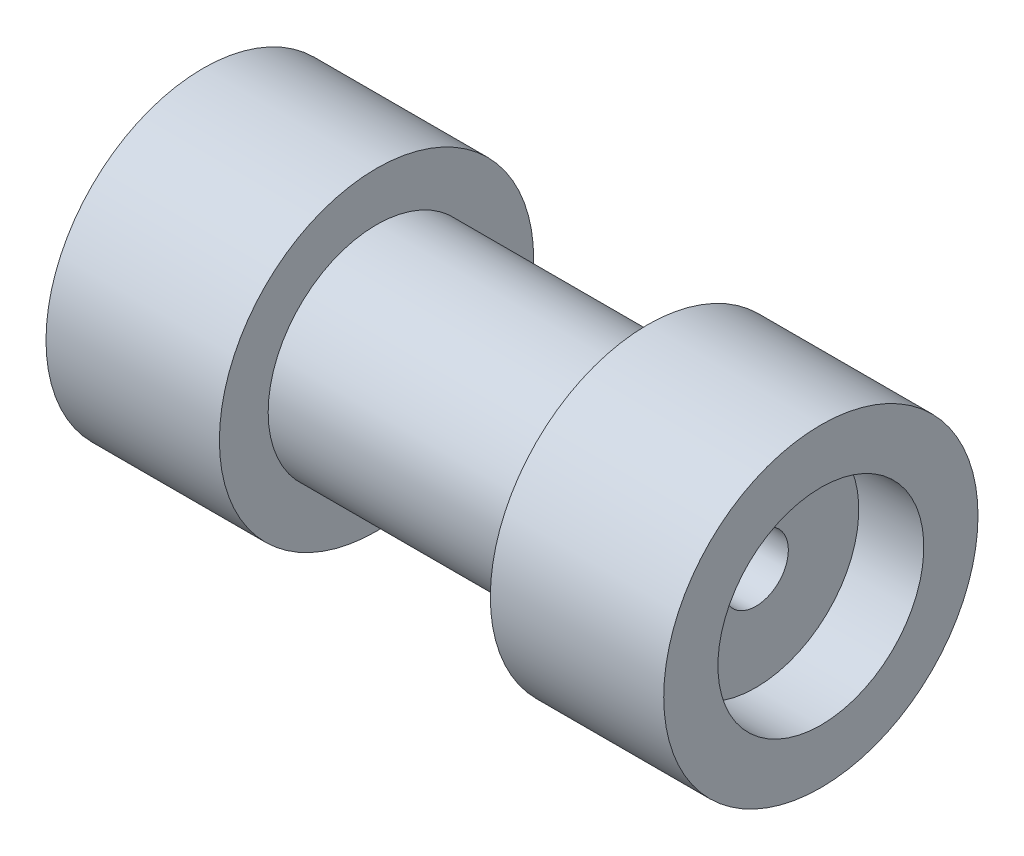
ISO-10303-21;
HEADER;
FILE_DESCRIPTION(('STEP AP214'),'2;1');
FILE_NAME('part.step','',(''),(''),'','','');
FILE_SCHEMA(('AUTOMOTIVE_DESIGN { 1 0 10303 214 1 1 1 1 }'));
ENDSEC;
DATA;
#1=APPLICATION_CONTEXT('core data for automotive mechanical design processes');
#2=APPLICATION_PROTOCOL_DEFINITION('international standard','automotive_design',2000,#1);
#3=PRODUCT_CONTEXT('',#1,'mechanical');
#4=PRODUCT('Part','Part','',(#3));
#5=PRODUCT_RELATED_PRODUCT_CATEGORY('part','',(#4));
#6=PRODUCT_DEFINITION_FORMATION('','',#4);
#7=PRODUCT_DEFINITION_CONTEXT('part definition',#1,'design');
#8=PRODUCT_DEFINITION('design','',#6,#7);
#9=PRODUCT_DEFINITION_SHAPE('','',#8);
#10=(LENGTH_UNIT() NAMED_UNIT(*) SI_UNIT(.MILLI.,.METRE.));
#11=(NAMED_UNIT(*) PLANE_ANGLE_UNIT() SI_UNIT($,.RADIAN.));
#12=(NAMED_UNIT(*) SI_UNIT($,.STERADIAN.) SOLID_ANGLE_UNIT());
#13=UNCERTAINTY_MEASURE_WITH_UNIT(LENGTH_MEASURE(1.E-05),#10,'distance_accuracy_value','');
#14=(GEOMETRIC_REPRESENTATION_CONTEXT(3) GLOBAL_UNCERTAINTY_ASSIGNED_CONTEXT((#13)) GLOBAL_UNIT_ASSIGNED_CONTEXT((#10,
#11,#12)) REPRESENTATION_CONTEXT('',''));
#15=CARTESIAN_POINT('',(0.,0.,0.));
#16=DIRECTION('',(0.,0.,1.));
#17=DIRECTION('',(1.,0.,0.));
#18=AXIS2_PLACEMENT_3D('',#15,#16,#17);
#19=CARTESIAN_POINT('',(-12.5,10.,0.));
#20=DIRECTION('',(-1.,0.,0.));
#21=DIRECTION('',(0.,-1.,0.));
#22=AXIS2_PLACEMENT_3D('',#19,#20,#21);
#23=PLANE('',#22);
#24=CARTESIAN_POINT('',(-12.5,0.,0.));
#25=DIRECTION('',(-1.,0.,0.));
#26=DIRECTION('',(0.,-1.,0.));
#27=AXIS2_PLACEMENT_3D('',#24,#25,#26);
#28=CIRCLE('',#27,14.5);
#29=CARTESIAN_POINT('',(-12.5,-14.5,0.));
#30=VERTEX_POINT('',#29);
#31=EDGE_CURVE('E10',#30,#30,#28,.T.);
#32=ORIENTED_EDGE('',*,*,#31,.F.);
#33=EDGE_LOOP('',(#32));
#34=FACE_BOUND('',#33,.T.);
#35=CARTESIAN_POINT('',(-12.5,0.,0.));
#36=DIRECTION('',(-1.,0.,0.));
#37=DIRECTION('',(0.,-1.,0.));
#38=AXIS2_PLACEMENT_3D('',#35,#36,#37);
#39=CIRCLE('',#38,10.);
#40=CARTESIAN_POINT('',(-12.5,-10.,0.));
#41=VERTEX_POINT('',#40);
#42=EDGE_CURVE('E71',#41,#41,#39,.T.);
#43=ORIENTED_EDGE('',*,*,#42,.T.);
#44=EDGE_LOOP('',(#43));
#45=FACE_BOUND('',#44,.T.);
#46=ADVANCED_FACE('F37',(#34,#45),#23,.F.);
#47=CARTESIAN_POINT('',(-22.5,0.,0.));
#48=DIRECTION('',(-1.,0.,0.));
#49=DIRECTION('',(0.,-1.,0.));
#50=AXIS2_PLACEMENT_3D('',#47,#48,#49);
#51=CYLINDRICAL_SURFACE('',#50,14.5);
#52=CARTESIAN_POINT('',(-28.5,0.,0.));
#53=DIRECTION('',(-1.,0.,0.));
#54=DIRECTION('',(0.,-1.,0.));
#55=AXIS2_PLACEMENT_3D('',#52,#53,#54);
#56=CIRCLE('',#55,14.5);
#57=CARTESIAN_POINT('',(-28.5,-14.5,0.));
#58=VERTEX_POINT('',#57);
#59=EDGE_CURVE('E44',#58,#58,#56,.T.);
#60=ORIENTED_EDGE('',*,*,#59,.F.);
#61=EDGE_LOOP('',(#60));
#62=FACE_BOUND('',#61,.T.);
#63=ORIENTED_EDGE('',*,*,#31,.T.);
#64=EDGE_LOOP('',(#63));
#65=FACE_BOUND('',#64,.T.);
#66=ADVANCED_FACE('F96',(#62,#65),#51,.T.);
#67=CARTESIAN_POINT('',(-28.5,14.5,0.));
#68=DIRECTION('',(1.,0.,0.));
#69=DIRECTION('',(0.,1.,0.));
#70=AXIS2_PLACEMENT_3D('',#67,#68,#69);
#71=PLANE('',#70);
#72=CARTESIAN_POINT('',(-28.5,0.,0.));
#73=DIRECTION('',(-1.,0.,0.));
#74=DIRECTION('',(0.,-1.,0.));
#75=AXIS2_PLACEMENT_3D('',#72,#73,#74);
#76=CIRCLE('',#75,9.5);
#77=CARTESIAN_POINT('',(-28.5,-9.5,0.));
#78=VERTEX_POINT('',#77);
#79=EDGE_CURVE('E48',#78,#78,#76,.T.);
#80=ORIENTED_EDGE('',*,*,#79,.F.);
#81=EDGE_LOOP('',(#80));
#82=FACE_BOUND('',#81,.T.);
#83=ORIENTED_EDGE('',*,*,#59,.T.);
#84=EDGE_LOOP('',(#83));
#85=FACE_BOUND('',#84,.T.);
#86=ADVANCED_FACE('F101',(#82,#85),#71,.F.);
#87=CARTESIAN_POINT('',(-22.5,0.,0.));
#88=DIRECTION('',(-1.,0.,0.));
#89=DIRECTION('',(0.,-1.,0.));
#90=AXIS2_PLACEMENT_3D('',#87,#88,#89);
#91=CYLINDRICAL_SURFACE('',#90,9.5);
#92=CARTESIAN_POINT('',(-22.5,0.,0.));
#93=DIRECTION('',(-1.,0.,0.));
#94=DIRECTION('',(0.,-1.,0.));
#95=AXIS2_PLACEMENT_3D('',#92,#93,#94);
#96=CIRCLE('',#95,9.5);
#97=CARTESIAN_POINT('',(-22.5,-9.5,0.));
#98=VERTEX_POINT('',#97);
#99=EDGE_CURVE('E53',#98,#98,#96,.T.);
#100=ORIENTED_EDGE('',*,*,#99,.F.);
#101=EDGE_LOOP('',(#100));
#102=FACE_BOUND('',#101,.T.);
#103=ORIENTED_EDGE('',*,*,#79,.T.);
#104=EDGE_LOOP('',(#103));
#105=FACE_BOUND('',#104,.T.);
#106=ADVANCED_FACE('F135',(#102,#105),#91,.F.);
#107=CARTESIAN_POINT('',(-22.5,9.5,0.));
#108=DIRECTION('',(1.,0.,0.));
#109=DIRECTION('',(0.,1.,0.));
#110=AXIS2_PLACEMENT_3D('',#107,#108,#109);
#111=PLANE('',#110);
#112=CARTESIAN_POINT('',(-22.5,0.,0.));
#113=DIRECTION('',(-1.,0.,0.));
#114=DIRECTION('',(0.,-1.,0.));
#115=AXIS2_PLACEMENT_3D('',#112,#113,#114);
#116=CIRCLE('',#115,3.);
#117=CARTESIAN_POINT('',(-22.5,-3.,0.));
#118=VERTEX_POINT('',#117);
#119=EDGE_CURVE('E74',#118,#118,#116,.T.);
#120=ORIENTED_EDGE('',*,*,#119,.F.);
#121=EDGE_LOOP('',(#120));
#122=FACE_BOUND('',#121,.T.);
#123=ORIENTED_EDGE('',*,*,#99,.T.);
#124=EDGE_LOOP('',(#123));
#125=FACE_BOUND('',#124,.T.);
#126=ADVANCED_FACE('F130',(#122,#125),#111,.F.);
#127=CARTESIAN_POINT('',(22.5,9.5,0.));
#128=DIRECTION('',(-1.,0.,0.));
#129=DIRECTION('',(0.,-1.,0.));
#130=AXIS2_PLACEMENT_3D('',#127,#128,#129);
#131=PLANE('',#130);
#132=CARTESIAN_POINT('',(22.5,0.,0.));
#133=DIRECTION('',(-1.,0.,0.));
#134=DIRECTION('',(0.,-1.,0.));
#135=AXIS2_PLACEMENT_3D('',#132,#133,#134);
#136=CIRCLE('',#135,3.);
#137=CARTESIAN_POINT('',(22.5,-3.00000000000002,0.));
#138=VERTEX_POINT('',#137);
#139=EDGE_CURVE('E40',#138,#138,#136,.T.);
#140=ORIENTED_EDGE('',*,*,#139,.T.);
#141=EDGE_LOOP('',(#140));
#142=FACE_BOUND('',#141,.T.);
#143=CARTESIAN_POINT('',(22.5,0.,0.));
#144=DIRECTION('',(-1.,0.,0.));
#145=DIRECTION('',(0.,-1.,0.));
#146=AXIS2_PLACEMENT_3D('',#143,#144,#145);
#147=CIRCLE('',#146,9.5);
#148=CARTESIAN_POINT('',(22.5,-9.49999999999999,0.));
#149=VERTEX_POINT('',#148);
#150=EDGE_CURVE('E56',#149,#149,#147,.T.);
#151=ORIENTED_EDGE('',*,*,#150,.F.);
#152=EDGE_LOOP('',(#151));
#153=FACE_BOUND('',#152,.T.);
#154=ADVANCED_FACE('F81',(#142,#153),#131,.F.);
#155=CARTESIAN_POINT('',(-22.5,0.,0.));
#156=DIRECTION('',(-1.,0.,0.));
#157=DIRECTION('',(0.,-1.,0.));
#158=AXIS2_PLACEMENT_3D('',#155,#156,#157);
#159=CYLINDRICAL_SURFACE('',#158,9.5);
#160=CARTESIAN_POINT('',(28.5,0.,0.));
#161=DIRECTION('',(-1.,0.,0.));
#162=DIRECTION('',(0.,-1.,0.));
#163=AXIS2_PLACEMENT_3D('',#160,#161,#162);
#164=CIRCLE('',#163,9.5);
#165=CARTESIAN_POINT('',(28.5,-9.49999999999999,0.));
#166=VERTEX_POINT('',#165);
#167=EDGE_CURVE('E59',#166,#166,#164,.T.);
#168=ORIENTED_EDGE('',*,*,#167,.F.);
#169=EDGE_LOOP('',(#168));
#170=FACE_BOUND('',#169,.T.);
#171=ORIENTED_EDGE('',*,*,#150,.T.);
#172=EDGE_LOOP('',(#171));
#173=FACE_BOUND('',#172,.T.);
#174=ADVANCED_FACE('F122',(#170,#173),#159,.F.);
#175=CARTESIAN_POINT('',(28.5,14.5,0.));
#176=DIRECTION('',(-1.,0.,0.));
#177=DIRECTION('',(0.,-1.,0.));
#178=AXIS2_PLACEMENT_3D('',#175,#176,#177);
#179=PLANE('',#178);
#180=CARTESIAN_POINT('',(28.5,0.,0.));
#181=DIRECTION('',(-1.,0.,0.));
#182=DIRECTION('',(0.,-1.,0.));
#183=AXIS2_PLACEMENT_3D('',#180,#181,#182);
#184=CIRCLE('',#183,14.5);
#185=CARTESIAN_POINT('',(28.5,-14.5,0.));
#186=VERTEX_POINT('',#185);
#187=EDGE_CURVE('E62',#186,#186,#184,.T.);
#188=ORIENTED_EDGE('',*,*,#187,.F.);
#189=EDGE_LOOP('',(#188));
#190=FACE_BOUND('',#189,.T.);
#191=ORIENTED_EDGE('',*,*,#167,.T.);
#192=EDGE_LOOP('',(#191));
#193=FACE_BOUND('',#192,.T.);
#194=ADVANCED_FACE('F116',(#190,#193),#179,.F.);
#195=CARTESIAN_POINT('',(-22.5,0.,0.));
#196=DIRECTION('',(-1.,0.,0.));
#197=DIRECTION('',(0.,-1.,0.));
#198=AXIS2_PLACEMENT_3D('',#195,#196,#197);
#199=CYLINDRICAL_SURFACE('',#198,14.5);
#200=CARTESIAN_POINT('',(12.5,0.,0.));
#201=DIRECTION('',(-1.,0.,0.));
#202=DIRECTION('',(0.,-1.,0.));
#203=AXIS2_PLACEMENT_3D('',#200,#201,#202);
#204=CIRCLE('',#203,14.5);
#205=CARTESIAN_POINT('',(12.5,-14.5,0.));
#206=VERTEX_POINT('',#205);
#207=EDGE_CURVE('E65',#206,#206,#204,.T.);
#208=ORIENTED_EDGE('',*,*,#207,.F.);
#209=EDGE_LOOP('',(#208));
#210=FACE_BOUND('',#209,.T.);
#211=ORIENTED_EDGE('',*,*,#187,.T.);
#212=EDGE_LOOP('',(#211));
#213=FACE_BOUND('',#212,.T.);
#214=ADVANCED_FACE('F110',(#210,#213),#199,.T.);
#215=CARTESIAN_POINT('',(12.5,10.,0.));
#216=DIRECTION('',(1.,0.,0.));
#217=DIRECTION('',(0.,1.,0.));
#218=AXIS2_PLACEMENT_3D('',#215,#216,#217);
#219=PLANE('',#218);
#220=CARTESIAN_POINT('',(12.5,0.,0.));
#221=DIRECTION('',(-1.,0.,0.));
#222=DIRECTION('',(0.,-1.,0.));
#223=AXIS2_PLACEMENT_3D('',#220,#221,#222);
#224=CIRCLE('',#223,10.);
#225=CARTESIAN_POINT('',(12.5,-10.,0.));
#226=VERTEX_POINT('',#225);
#227=EDGE_CURVE('E68',#226,#226,#224,.T.);
#228=ORIENTED_EDGE('',*,*,#227,.F.);
#229=EDGE_LOOP('',(#228));
#230=FACE_BOUND('',#229,.T.);
#231=ORIENTED_EDGE('',*,*,#207,.T.);
#232=EDGE_LOOP('',(#231));
#233=FACE_BOUND('',#232,.T.);
#234=ADVANCED_FACE('F92',(#230,#233),#219,.F.);
#235=CARTESIAN_POINT('',(-22.5,0.,0.));
#236=DIRECTION('',(-1.,0.,0.));
#237=DIRECTION('',(0.,-1.,0.));
#238=AXIS2_PLACEMENT_3D('',#235,#236,#237);
#239=CYLINDRICAL_SURFACE('',#238,10.);
#240=ORIENTED_EDGE('',*,*,#42,.F.);
#241=EDGE_LOOP('',(#240));
#242=FACE_BOUND('',#241,.T.);
#243=ORIENTED_EDGE('',*,*,#227,.T.);
#244=EDGE_LOOP('',(#243));
#245=FACE_BOUND('',#244,.T.);
#246=ADVANCED_FACE('F86',(#242,#245),#239,.T.);
#247=CARTESIAN_POINT('',(28.5,0.,0.));
#248=DIRECTION('',(-1.,0.,0.));
#249=DIRECTION('',(0.,-1.,0.));
#250=AXIS2_PLACEMENT_3D('',#247,#248,#249);
#251=CYLINDRICAL_SURFACE('',#250,3.);
#252=CARTESIAN_POINT('',(-22.5,-3.,0.));
#253=CARTESIAN_POINT('',(-22.03125,-3.,0.));
#254=CARTESIAN_POINT('',(-21.5625,-3.,0.));
#255=CARTESIAN_POINT('',(-20.625,-3.,0.));
#256=CARTESIAN_POINT('',(-20.15625,-3.,0.));
#257=CARTESIAN_POINT('',(-19.21875,-3.,0.));
#258=CARTESIAN_POINT('',(-18.75,-3.,0.));
#259=CARTESIAN_POINT('',(-17.8125,-3.,0.));
#260=CARTESIAN_POINT('',(-17.34375,-3.,0.));
#261=CARTESIAN_POINT('',(-16.40625,-3.,0.));
#262=CARTESIAN_POINT('',(-15.9375,-3.00000000000001,0.));
#263=CARTESIAN_POINT('',(-15.,-3.00000000000001,0.));
#264=CARTESIAN_POINT('',(-14.53125,-3.00000000000001,0.));
#265=CARTESIAN_POINT('',(-13.59375,-3.00000000000001,0.));
#266=CARTESIAN_POINT('',(-13.125,-3.00000000000001,0.));
#267=CARTESIAN_POINT('',(-12.1875,-3.00000000000001,0.));
#268=CARTESIAN_POINT('',(-11.71875,-3.00000000000001,0.));
#269=CARTESIAN_POINT('',(-10.78125,-3.00000000000001,0.));
#270=CARTESIAN_POINT('',(-10.3125,-3.00000000000001,0.));
#271=CARTESIAN_POINT('',(-9.37499999999999,-3.00000000000001,0.));
#272=CARTESIAN_POINT('',(-8.90624999999999,-3.00000000000001,0.));
#273=CARTESIAN_POINT('',(-7.96874999999999,-3.00000000000001,0.));
#274=CARTESIAN_POINT('',(-7.5,-3.00000000000001,0.));
#275=CARTESIAN_POINT('',(-6.5625,-3.00000000000001,0.));
#276=CARTESIAN_POINT('',(-6.09375,-3.00000000000001,0.));
#277=CARTESIAN_POINT('',(-5.15625,-3.00000000000001,0.));
#278=CARTESIAN_POINT('',(-4.68749999999999,-3.00000000000001,0.));
#279=CARTESIAN_POINT('',(-3.74999999999999,-3.00000000000001,0.));
#280=CARTESIAN_POINT('',(-3.28124999999999,-3.00000000000001,0.));
#281=CARTESIAN_POINT('',(-2.34375,-3.00000000000001,0.));
#282=CARTESIAN_POINT('',(-1.875,-3.00000000000001,0.));
#283=CARTESIAN_POINT('',(-0.937499999999997,-3.00000000000001,0.));
#284=CARTESIAN_POINT('',(-0.468749999999997,-3.00000000000001,0.));
#285=CARTESIAN_POINT('',(0.468750000000004,-3.00000000000001,0.));
#286=CARTESIAN_POINT('',(0.937500000000004,-3.00000000000001,0.));
#287=CARTESIAN_POINT('',(1.87500000000001,-3.00000000000001,0.));
#288=CARTESIAN_POINT('',(2.34375000000001,-3.00000000000001,0.));
#289=CARTESIAN_POINT('',(3.28125,-3.00000000000001,0.));
#290=CARTESIAN_POINT('',(3.75,-3.00000000000001,0.));
#291=CARTESIAN_POINT('',(4.6875,-3.00000000000001,0.));
#292=CARTESIAN_POINT('',(5.15625,-3.00000000000001,0.));
#293=CARTESIAN_POINT('',(6.09375000000001,-3.00000000000001,0.));
#294=CARTESIAN_POINT('',(6.56250000000001,-3.00000000000001,0.));
#295=CARTESIAN_POINT('',(7.50000000000001,-3.00000000000001,0.));
#296=CARTESIAN_POINT('',(7.96875000000001,-3.00000000000001,0.));
#297=CARTESIAN_POINT('',(8.90625000000001,-3.00000000000001,0.));
#298=CARTESIAN_POINT('',(9.37500000000001,-3.00000000000001,0.));
#299=CARTESIAN_POINT('',(10.3125,-3.00000000000001,0.));
#300=CARTESIAN_POINT('',(10.78125,-3.00000000000001,0.));
#301=CARTESIAN_POINT('',(11.71875,-3.00000000000001,0.));
#302=CARTESIAN_POINT('',(12.1875,-3.00000000000001,0.));
#303=CARTESIAN_POINT('',(13.125,-3.00000000000001,0.));
#304=CARTESIAN_POINT('',(13.59375,-3.00000000000001,0.));
#305=CARTESIAN_POINT('',(14.53125,-3.00000000000001,0.));
#306=CARTESIAN_POINT('',(15.,-3.00000000000001,0.));
#307=CARTESIAN_POINT('',(15.9375,-3.00000000000001,0.));
#308=CARTESIAN_POINT('',(16.40625,-3.00000000000001,0.));
#309=CARTESIAN_POINT('',(17.34375,-3.00000000000001,0.));
#310=CARTESIAN_POINT('',(17.8125,-3.00000000000001,0.));
#311=CARTESIAN_POINT('',(18.75,-3.00000000000001,0.));
#312=CARTESIAN_POINT('',(19.21875,-3.00000000000001,0.));
#313=CARTESIAN_POINT('',(20.15625,-3.00000000000001,0.));
#314=CARTESIAN_POINT('',(20.625,-3.00000000000002,0.));
#315=CARTESIAN_POINT('',(21.5625,-3.00000000000002,0.));
#316=CARTESIAN_POINT('',(22.03125,-3.00000000000002,0.));
#317=CARTESIAN_POINT('',(22.5,-3.00000000000002,0.));
#318=B_SPLINE_CURVE_WITH_KNOTS('',3,(#252,#253,#254,#255,#256,#257,#258,#259,#260,#261,#262,
#263,#264,#265,#266,#267,#268,#269,#270,#271,#272,#273,#274,#275,#276,#277,#278,#279,#280,#281,
#282,#283,#284,#285,#286,#287,#288,#289,#290,#291,#292,#293,#294,#295,#296,#297,#298,#299,#300,
#301,#302,#303,#304,#305,#306,#307,#308,#309,#310,#311,#312,#313,#314,#315,#316,#317),
.UNSPECIFIED.,.F.,.F.,(4,2,2,2,2,2,2,2,2,2,2,2,2,2,2,2,2,2,2,2,2,2,2,2,2,2,2,2,2,2,2,2,4),(0.,
1.40625,2.8125,4.21875,5.62500000000001,7.03125,8.4375,9.84375,11.25,12.65625,14.0625,15.46875,
16.875,18.28125,19.6875,21.09375,22.5,23.90625,25.3125,26.71875,28.125,29.53125,30.9375,
32.34375,33.75,35.15625,36.5625,37.96875,39.375,40.78125,42.1875,43.59375,45.),.UNSPECIFIED.);
#319=EDGE_CURVE('BSEAM84',#118,#138,#318,.T.);
#320=ORIENTED_EDGE('',*,*,#119,.T.);
#321=ORIENTED_EDGE('',*,*,#139,.F.);
#322=ORIENTED_EDGE('',*,*,#319,.T.);
#323=ORIENTED_EDGE('',*,*,#319,.F.);
#324=EDGE_LOOP('',(#320,#322,#321,#323));
#325=FACE_BOUND('',#324,.T.);
#326=ADVANCED_FACE('F84',(#325),#251,.F.);
#327=CLOSED_SHELL('',(#46,#66,#86,#106,#126,#154,#174,#194,#214,#234,#246,#326));
#328=MANIFOLD_SOLID_BREP('B2',#327);
#329=ADVANCED_BREP_SHAPE_REPRESENTATION('',(#18,#328),#14);
#330=SHAPE_DEFINITION_REPRESENTATION(#9,#329);
ENDSEC;
END-ISO-10303-21;
